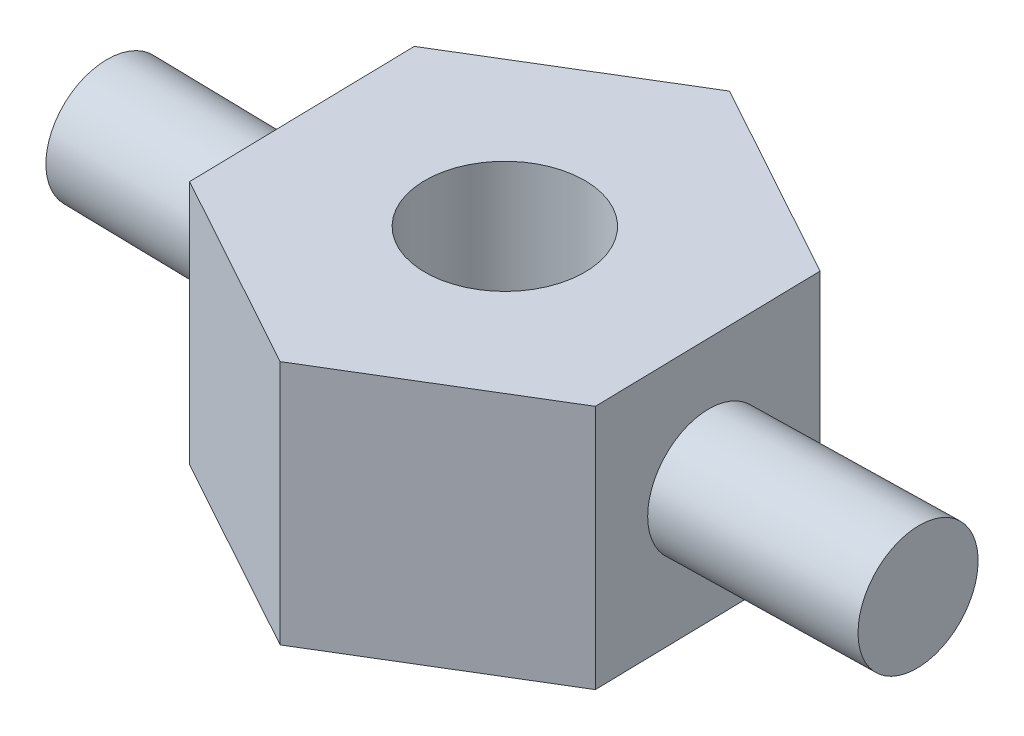
ISO-10303-21;
HEADER;
FILE_DESCRIPTION(('STEP AP214'),'2;1');
FILE_NAME('part.step','',(''),(''),'','','');
FILE_SCHEMA(('AUTOMOTIVE_DESIGN { 1 0 10303 214 1 1 1 1 }'));
ENDSEC;
DATA;
#1=APPLICATION_CONTEXT('core data for automotive mechanical design processes');
#2=APPLICATION_PROTOCOL_DEFINITION('international standard','automotive_design',2000,#1);
#3=PRODUCT_CONTEXT('',#1,'mechanical');
#4=PRODUCT('Part','Part','',(#3));
#5=PRODUCT_RELATED_PRODUCT_CATEGORY('part','',(#4));
#6=PRODUCT_DEFINITION_FORMATION('','',#4);
#7=PRODUCT_DEFINITION_CONTEXT('part definition',#1,'design');
#8=PRODUCT_DEFINITION('design','',#6,#7);
#9=PRODUCT_DEFINITION_SHAPE('','',#8);
#10=(LENGTH_UNIT() NAMED_UNIT(*) SI_UNIT(.MILLI.,.METRE.));
#11=(NAMED_UNIT(*) PLANE_ANGLE_UNIT() SI_UNIT($,.RADIAN.));
#12=(NAMED_UNIT(*) SI_UNIT($,.STERADIAN.) SOLID_ANGLE_UNIT());
#13=UNCERTAINTY_MEASURE_WITH_UNIT(LENGTH_MEASURE(1.E-05),#10,'distance_accuracy_value','');
#14=(GEOMETRIC_REPRESENTATION_CONTEXT(3) GLOBAL_UNCERTAINTY_ASSIGNED_CONTEXT((#13)) GLOBAL_UNIT_ASSIGNED_CONTEXT((#10,
#11,#12)) REPRESENTATION_CONTEXT('',''));
#15=CARTESIAN_POINT('',(0.,0.,0.));
#16=DIRECTION('',(0.,0.,1.));
#17=DIRECTION('',(1.,0.,0.));
#18=AXIS2_PLACEMENT_3D('',#15,#16,#17);
#19=CARTESIAN_POINT('',(-81.9743648724854,100.,-45.0777223401047));
#20=DIRECTION('',(0.999783018308974,0.,-0.0208306577187702));
#21=DIRECTION('',(-0.0208306577187702,0.,-0.999783018308973));
#22=AXIS2_PLACEMENT_3D('',#19,#20,#21);
#23=PLANE('',#22);
#24=DIRECTION('',(0.,1.,0.));
#25=VECTOR('',#24,1.);
#26=CARTESIAN_POINT('',(-81.0351624779531,100.,6.24500451351651E-13));
#27=LINE('',#26,#25);
#28=CARTESIAN_POINT('',(-81.0351624779531,25.0570530432761,6.38378239159465E-13));
#29=VERTEX_POINT('',#28);
#30=CARTESIAN_POINT('',(-81.0351624779531,74.9429469567239,6.38378239159465E-13));
#31=VERTEX_POINT('',#30);
#32=EDGE_CURVE('E51',#29,#31,#27,.T.);
#33=ORIENTED_EDGE('',*,*,#32,.F.);
#34=CARTESIAN_POINT('',(-81.070355497556,50.,-1.68911533361008));
#35=DIRECTION('',(0.999783018308974,0.,-0.0208306577187702));
#36=DIRECTION('',(0.0208306577187702,0.,0.999783018308973));
#37=AXIS2_PLACEMENT_3D('',#34,#35,#36);
#38=ELLIPSE('',#37,25.0217146597395,25.);
#39=EDGE_CURVE('E11',#29,#31,#38,.T.);
#40=ORIENTED_EDGE('',*,*,#39,.T.);
#41=EDGE_LOOP('',(#33,#40));
#42=FACE_BOUND('',#41,.T.);
#43=DIRECTION('',(0.0208306577187702,0.,0.999783018308973));
#44=VECTOR('',#43,1.);
#45=CARTESIAN_POINT('',(-81.9743648724854,0.,-45.0777223401047));
#46=LINE('',#45,#44);
#47=CARTESIAN_POINT('',(-81.9743648724854,0.,-45.0777223401047));
#48=VERTEX_POINT('',#47);
#49=CARTESIAN_POINT('',(-80.0256351275146,0.,48.4530212686147));
#50=VERTEX_POINT('',#49);
#51=EDGE_CURVE('E141',#48,#50,#46,.T.);
#52=ORIENTED_EDGE('',*,*,#51,.T.);
#53=DIRECTION('',(0.,-1.,0.));
#54=VECTOR('',#53,1.);
#55=CARTESIAN_POINT('',(-80.0256351275146,100.,48.4530212686147));
#56=LINE('',#55,#54);
#57=CARTESIAN_POINT('',(-80.0256351275146,100.,48.4530212686147));
#58=VERTEX_POINT('',#57);
#59=EDGE_CURVE('E170',#58,#50,#56,.T.);
#60=ORIENTED_EDGE('',*,*,#59,.F.);
#61=DIRECTION('',(0.0208306577187702,0.,0.999783018308973));
#62=VECTOR('',#61,1.);
#63=CARTESIAN_POINT('',(-81.9743648724854,100.,-45.0777223401047));
#64=LINE('',#63,#62);
#65=CARTESIAN_POINT('',(-81.9743648724854,100.,-45.0777223401047));
#66=VERTEX_POINT('',#65);
#67=EDGE_CURVE('E159',#66,#58,#64,.T.);
#68=ORIENTED_EDGE('',*,*,#67,.F.);
#69=DIRECTION('',(0.,-1.,0.));
#70=VECTOR('',#69,1.);
#71=CARTESIAN_POINT('',(-81.9743648724854,100.,-45.0777223401047));
#72=LINE('',#71,#70);
#73=EDGE_CURVE('E137',#66,#48,#72,.T.);
#74=ORIENTED_EDGE('',*,*,#73,.T.);
#75=EDGE_LOOP('',(#52,#60,#68,#74));
#76=FACE_BOUND('',#75,.T.);
#77=ADVANCED_FACE('F43',(#42,#76),#23,.F.);
#78=CARTESIAN_POINT('',(-80.0256351275146,100.,48.4530212686147));
#79=DIRECTION('',(0.481851630392494,0.,-0.876252820987238));
#80=DIRECTION('',(-0.876252820987239,0.,-0.481851630392493));
#81=AXIS2_PLACEMENT_3D('',#78,#79,#80);
#82=PLANE('',#81);
#83=DIRECTION('',(0.876252820987239,0.,0.481851630392493));
#84=VECTOR('',#83,1.);
#85=CARTESIAN_POINT('',(-80.0256351275146,0.,48.4530212686147));
#86=LINE('',#85,#84);
#87=CARTESIAN_POINT('',(1.94872974497068,0.,93.5307436087193));
#88=VERTEX_POINT('',#87);
#89=EDGE_CURVE('E145',#50,#88,#86,.T.);
#90=ORIENTED_EDGE('',*,*,#89,.T.);
#91=DIRECTION('',(0.,-1.,0.));
#92=VECTOR('',#91,1.);
#93=CARTESIAN_POINT('',(1.94872974497046,100.,93.5307436087193));
#94=LINE('',#93,#92);
#95=CARTESIAN_POINT('',(1.94872974497046,100.,93.5307436087193));
#96=VERTEX_POINT('',#95);
#97=EDGE_CURVE('E166',#96,#88,#94,.T.);
#98=ORIENTED_EDGE('',*,*,#97,.F.);
#99=DIRECTION('',(0.876252820987239,0.,0.481851630392493));
#100=VECTOR('',#99,1.);
#101=CARTESIAN_POINT('',(-80.0256351275146,100.,48.4530212686147));
#102=LINE('',#101,#100);
#103=EDGE_CURVE('E100',#58,#96,#102,.T.);
#104=ORIENTED_EDGE('',*,*,#103,.F.);
#105=ORIENTED_EDGE('',*,*,#59,.T.);
#106=EDGE_LOOP('',(#90,#98,#104,#105));
#107=FACE_BOUND('',#106,.T.);
#108=ADVANCED_FACE('F227',(#107),#82,.F.);
#109=CARTESIAN_POINT('',(1.94872974497046,100.,93.5307436087193));
#110=DIRECTION('',(-0.51793138791648,0.,-0.855422163268468));
#111=DIRECTION('',(-0.855422163268469,0.,0.51793138791648));
#112=AXIS2_PLACEMENT_3D('',#109,#110,#111);
#113=PLANE('',#112);
#114=DIRECTION('',(0.855422163268469,0.,-0.51793138791648));
#115=VECTOR('',#114,1.);
#116=CARTESIAN_POINT('',(1.94872974497068,0.,93.5307436087193));
#117=LINE('',#116,#115);
#118=CARTESIAN_POINT('',(81.9743648724854,0.,45.0777223401046));
#119=VERTEX_POINT('',#118);
#120=EDGE_CURVE('E149',#88,#119,#117,.T.);
#121=ORIENTED_EDGE('',*,*,#120,.T.);
#122=DIRECTION('',(0.,-1.,0.));
#123=VECTOR('',#122,1.);
#124=CARTESIAN_POINT('',(81.9743648724853,100.,45.0777223401046));
#125=LINE('',#124,#123);
#126=CARTESIAN_POINT('',(81.9743648724853,100.,45.0777223401046));
#127=VERTEX_POINT('',#126);
#128=EDGE_CURVE('E129',#127,#119,#125,.T.);
#129=ORIENTED_EDGE('',*,*,#128,.F.);
#130=DIRECTION('',(0.855422163268469,0.,-0.51793138791648));
#131=VECTOR('',#130,1.);
#132=CARTESIAN_POINT('',(1.94872974497046,100.,93.5307436087193));
#133=LINE('',#132,#131);
#134=EDGE_CURVE('E115',#96,#127,#133,.T.);
#135=ORIENTED_EDGE('',*,*,#134,.F.);
#136=ORIENTED_EDGE('',*,*,#97,.T.);
#137=EDGE_LOOP('',(#121,#129,#135,#136));
#138=FACE_BOUND('',#137,.T.);
#139=ADVANCED_FACE('F235',(#138),#113,.F.);
#140=CARTESIAN_POINT('',(81.9743648724853,100.,45.0777223401046));
#141=DIRECTION('',(-0.999783018308974,0.,0.0208306577187704));
#142=DIRECTION('',(0.0208306577187704,0.,0.999783018308973));
#143=AXIS2_PLACEMENT_3D('',#140,#141,#142);
#144=PLANE('',#143);
#145=CARTESIAN_POINT('',(80.9999999999997,50.,-1.68764946425502));
#146=DIRECTION('',(0.999783018308974,0.,-0.0208306577187704));
#147=DIRECTION('',(-0.0208306577187704,0.,-0.999783018308973));
#148=AXIS2_PLACEMENT_3D('',#145,#146,#147);
#149=CIRCLE('',#148,25.);
#150=CARTESIAN_POINT('',(81.5207664429689,50.0000000000001,23.3069259934693));
#151=VERTEX_POINT('',#150);
#152=EDGE_CURVE('E172',#151,#151,#149,.T.);
#153=ORIENTED_EDGE('',*,*,#152,.F.);
#154=EDGE_LOOP('',(#153));
#155=FACE_BOUND('',#154,.T.);
#156=DIRECTION('',(-0.0208306577187704,0.,-0.999783018308973));
#157=VECTOR('',#156,1.);
#158=CARTESIAN_POINT('',(81.9743648724854,0.,45.0777223401046));
#159=LINE('',#158,#157);
#160=CARTESIAN_POINT('',(80.0256351275146,0.,-48.4530212686147));
#161=VERTEX_POINT('',#160);
#162=EDGE_CURVE('E125',#119,#161,#159,.T.);
#163=ORIENTED_EDGE('',*,*,#162,.T.);
#164=DIRECTION('',(0.,-1.,0.));
#165=VECTOR('',#164,1.);
#166=CARTESIAN_POINT('',(80.0256351275146,100.,-48.4530212686148));
#167=LINE('',#166,#165);
#168=CARTESIAN_POINT('',(80.0256351275146,100.,-48.4530212686148));
#169=VERTEX_POINT('',#168);
#170=EDGE_CURVE('E122',#169,#161,#167,.T.);
#171=ORIENTED_EDGE('',*,*,#170,.F.);
#172=DIRECTION('',(-0.0208306577187704,0.,-0.999783018308973));
#173=VECTOR('',#172,1.);
#174=CARTESIAN_POINT('',(81.9743648724853,100.,45.0777223401046));
#175=LINE('',#174,#173);
#176=EDGE_CURVE('E108',#127,#169,#175,.T.);
#177=ORIENTED_EDGE('',*,*,#176,.F.);
#178=ORIENTED_EDGE('',*,*,#128,.T.);
#179=EDGE_LOOP('',(#163,#171,#177,#178));
#180=FACE_BOUND('',#179,.T.);
#181=ADVANCED_FACE('F123',(#155,#180),#144,.F.);
#182=CARTESIAN_POINT('',(80.0256351275146,100.,-48.4530212686148));
#183=DIRECTION('',(-0.481851630392494,0.,0.876252820987238));
#184=DIRECTION('',(0.876252820987239,0.,0.481851630392493));
#185=AXIS2_PLACEMENT_3D('',#182,#183,#184);
#186=PLANE('',#185);
#187=DIRECTION('',(-0.876252820987239,0.,-0.481851630392493));
#188=VECTOR('',#187,1.);
#189=CARTESIAN_POINT('',(80.0256351275146,0.,-48.4530212686147));
#190=LINE('',#189,#188);
#191=CARTESIAN_POINT('',(-1.94872974497073,1.11022302462516E-13,-93.5307436087193));
#192=VERTEX_POINT('',#191);
#193=EDGE_CURVE('E154',#161,#192,#190,.T.);
#194=ORIENTED_EDGE('',*,*,#193,.T.);
#195=DIRECTION('',(0.,-1.,0.));
#196=VECTOR('',#195,1.);
#197=CARTESIAN_POINT('',(-1.94872974497101,100.,-93.5307436087193));
#198=LINE('',#197,#196);
#199=CARTESIAN_POINT('',(-1.94872974497101,100.,-93.5307436087193));
#200=VERTEX_POINT('',#199);
#201=EDGE_CURVE('E130',#200,#192,#198,.T.);
#202=ORIENTED_EDGE('',*,*,#201,.F.);
#203=DIRECTION('',(-0.876252820987239,0.,-0.481851630392493));
#204=VECTOR('',#203,1.);
#205=CARTESIAN_POINT('',(80.0256351275146,100.,-48.4530212686148));
#206=LINE('',#205,#204);
#207=EDGE_CURVE('E112',#169,#200,#206,.T.);
#208=ORIENTED_EDGE('',*,*,#207,.F.);
#209=ORIENTED_EDGE('',*,*,#170,.T.);
#210=EDGE_LOOP('',(#194,#202,#208,#209));
#211=FACE_BOUND('',#210,.T.);
#212=ADVANCED_FACE('F132',(#211),#186,.F.);
#213=CARTESIAN_POINT('',(-1.94872974497101,100.,-93.5307436087193));
#214=DIRECTION('',(0.51793138791648,0.,0.855422163268468));
#215=DIRECTION('',(0.855422163268469,0.,-0.51793138791648));
#216=AXIS2_PLACEMENT_3D('',#213,#214,#215);
#217=PLANE('',#216);
#218=DIRECTION('',(-0.855422163268469,0.,0.51793138791648));
#219=VECTOR('',#218,1.);
#220=CARTESIAN_POINT('',(-1.94872974497073,1.11022302462516E-13,-93.5307436087193));
#221=LINE('',#220,#219);
#222=EDGE_CURVE('E91',#192,#48,#221,.T.);
#223=ORIENTED_EDGE('',*,*,#222,.T.);
#224=ORIENTED_EDGE('',*,*,#73,.F.);
#225=DIRECTION('',(-0.855422163268469,0.,0.51793138791648));
#226=VECTOR('',#225,1.);
#227=CARTESIAN_POINT('',(-1.94872974497101,100.,-93.5307436087193));
#228=LINE('',#227,#226);
#229=EDGE_CURVE('E64',#200,#66,#228,.T.);
#230=ORIENTED_EDGE('',*,*,#229,.F.);
#231=ORIENTED_EDGE('',*,*,#201,.T.);
#232=EDGE_LOOP('',(#223,#224,#230,#231));
#233=FACE_BOUND('',#232,.T.);
#234=ADVANCED_FACE('F247',(#233),#217,.F.);
#235=CARTESIAN_POINT('',(-2.77555756156289E-13,100.,0.));
#236=DIRECTION('',(0.,1.,0.));
#237=DIRECTION('',(0.,0.,0.999999999999998));
#238=AXIS2_PLACEMENT_3D('',#235,#236,#237);
#239=PLANE('',#238);
#240=CARTESIAN_POINT('',(-2.77555756156289E-13,100.,0.));
#241=DIRECTION('',(0.,-1.,0.));
#242=DIRECTION('',(0.,0.,-0.999999999999998));
#243=AXIS2_PLACEMENT_3D('',#240,#241,#242);
#244=CIRCLE('',#243,32.5);
#245=CARTESIAN_POINT('',(-2.76428185896904E-13,100.,-32.4999999999999));
#246=VERTEX_POINT('',#245);
#247=EDGE_CURVE('E146',#246,#246,#244,.T.);
#248=ORIENTED_EDGE('',*,*,#247,.T.);
#249=EDGE_LOOP('',(#248));
#250=FACE_BOUND('',#249,.T.);
#251=ORIENTED_EDGE('',*,*,#67,.T.);
#252=ORIENTED_EDGE('',*,*,#103,.T.);
#253=ORIENTED_EDGE('',*,*,#134,.T.);
#254=ORIENTED_EDGE('',*,*,#176,.T.);
#255=ORIENTED_EDGE('',*,*,#207,.T.);
#256=ORIENTED_EDGE('',*,*,#229,.T.);
#257=EDGE_LOOP('',(#251,#252,#253,#254,#255,#256));
#258=FACE_BOUND('',#257,.T.);
#259=ADVANCED_FACE('F110',(#250,#258),#239,.T.);
#260=CARTESIAN_POINT('',(0.,0.,0.));
#261=DIRECTION('',(0.,1.,0.));
#262=DIRECTION('',(0.,0.,0.999999999999998));
#263=AXIS2_PLACEMENT_3D('',#260,#261,#262);
#264=PLANE('',#263);
#265=CARTESIAN_POINT('',(0.,0.,0.));
#266=DIRECTION('',(0.,-1.,0.));
#267=DIRECTION('',(0.,0.,-0.999999999999998));
#268=AXIS2_PLACEMENT_3D('',#265,#266,#267);
#269=CIRCLE('',#268,32.5);
#270=CARTESIAN_POINT('',(0.,0.,-32.5));
#271=VERTEX_POINT('',#270);
#272=EDGE_CURVE('E191',#271,#271,#269,.T.);
#273=ORIENTED_EDGE('',*,*,#272,.F.);
#274=EDGE_LOOP('',(#273));
#275=FACE_BOUND('',#274,.T.);
#276=ORIENTED_EDGE('',*,*,#51,.F.);
#277=ORIENTED_EDGE('',*,*,#222,.F.);
#278=ORIENTED_EDGE('',*,*,#193,.F.);
#279=ORIENTED_EDGE('',*,*,#162,.F.);
#280=ORIENTED_EDGE('',*,*,#120,.F.);
#281=ORIENTED_EDGE('',*,*,#89,.F.);
#282=EDGE_LOOP('',(#276,#277,#278,#279,#280,#281));
#283=FACE_BOUND('',#282,.T.);
#284=ADVANCED_FACE('F232',(#275,#283),#264,.F.);
#285=CARTESIAN_POINT('',(-2.77555756156289E-13,100.,0.));
#286=DIRECTION('',(0.,-1.,0.));
#287=DIRECTION('',(0.,0.,-0.999999999999998));
#288=AXIS2_PLACEMENT_3D('',#285,#286,#287);
#289=CYLINDRICAL_SURFACE('',#288,32.5);
#290=ORIENTED_EDGE('',*,*,#247,.F.);
#291=EDGE_LOOP('',(#290));
#292=FACE_BOUND('',#291,.T.);
#293=ORIENTED_EDGE('',*,*,#272,.T.);
#294=EDGE_LOOP('',(#293));
#295=FACE_BOUND('',#294,.T.);
#296=ADVANCED_FACE('F252',(#292,#295),#289,.F.);
#297=CARTESIAN_POINT('',(164.981773537954,50.0000000000001,-3.43742471263175));
#298=DIRECTION('',(-0.999783018308974,0.,0.0208306577187704));
#299=DIRECTION('',(0.0208306577187704,0.,0.999783018308973));
#300=AXIS2_PLACEMENT_3D('',#297,#298,#299);
#301=CYLINDRICAL_SURFACE('',#300,25.);
#302=CARTESIAN_POINT('',(164.981773537954,50.0000000000001,-3.43742471263175));
#303=DIRECTION('',(0.999783018308974,0.,-0.0208306577187704));
#304=DIRECTION('',(-0.0208306577187704,0.,-0.999783018308973));
#305=AXIS2_PLACEMENT_3D('',#302,#303,#304);
#306=CIRCLE('',#305,25.);
#307=CARTESIAN_POINT('',(165.502539980923,50.0000000000001,21.5571507450926));
#308=VERTEX_POINT('',#307);
#309=EDGE_CURVE('E186',#308,#308,#306,.T.);
#310=CARTESIAN_POINT('',(165.502539980923,50.0000000000001,21.5571507450926));
#311=CARTESIAN_POINT('',(164.627729839902,50.0000000000001,21.5753775705965));
#312=CARTESIAN_POINT('',(163.752919698882,50.0000000000001,21.5936043961004));
#313=CARTESIAN_POINT('',(162.003299416841,50.0000000000001,21.6300580471083));
#314=CARTESIAN_POINT('',(161.128489275821,50.0000000000001,21.6482848726122));
#315=CARTESIAN_POINT('',(159.37886899378,50.0000000000001,21.6847385236201));
#316=CARTESIAN_POINT('',(158.50405885276,50.0000000000001,21.702965349124));
#317=CARTESIAN_POINT('',(156.754438570719,50.0000000000001,21.7394190001318));
#318=CARTESIAN_POINT('',(155.879628429699,50.0000000000001,21.7576458256357));
#319=CARTESIAN_POINT('',(154.130008147658,50.0000000000001,21.7940994766436));
#320=CARTESIAN_POINT('',(153.255198006638,50.0000000000001,21.8123263021475));
#321=CARTESIAN_POINT('',(151.505577724597,50.0000000000001,21.8487799531554));
#322=CARTESIAN_POINT('',(150.630767583577,50.0000000000001,21.8670067786593));
#323=CARTESIAN_POINT('',(148.881147301536,50.0000000000001,21.9034604296671));
#324=CARTESIAN_POINT('',(148.006337160516,50.0000000000001,21.9216872551711));
#325=CARTESIAN_POINT('',(146.256716878475,50.0000000000001,21.9581409061789));
#326=CARTESIAN_POINT('',(145.381906737455,50.0000000000001,21.9763677316828));
#327=CARTESIAN_POINT('',(143.632286455414,50.0000000000001,22.0128213826907));
#328=CARTESIAN_POINT('',(142.757476314394,50.0000000000001,22.0310482081946));
#329=CARTESIAN_POINT('',(141.007856032353,50.0000000000001,22.0675018592025));
#330=CARTESIAN_POINT('',(140.133045891333,50.0000000000001,22.0857286847064));
#331=CARTESIAN_POINT('',(138.383425609292,50.0000000000001,22.1221823357142));
#332=CARTESIAN_POINT('',(137.508615468272,50.0000000000001,22.1404091612182));
#333=CARTESIAN_POINT('',(135.758995186231,50.0000000000001,22.176862812226));
#334=CARTESIAN_POINT('',(134.88418504521,50.0000000000001,22.1950896377299));
#335=CARTESIAN_POINT('',(133.13456476317,50.0000000000001,22.2315432887378));
#336=CARTESIAN_POINT('',(132.259754622149,50.0000000000001,22.2497701142417));
#337=CARTESIAN_POINT('',(130.510134340109,50.0000000000001,22.2862237652495));
#338=CARTESIAN_POINT('',(129.635324199088,50.0000000000001,22.3044505907535));
#339=CARTESIAN_POINT('',(127.885703917048,50.0000000000001,22.3409042417613));
#340=CARTESIAN_POINT('',(127.010893776027,50.0000000000001,22.3591310672652));
#341=CARTESIAN_POINT('',(125.261273493987,50.0000000000001,22.3955847182731));
#342=CARTESIAN_POINT('',(124.386463352966,50.0000000000001,22.413811543777));
#343=CARTESIAN_POINT('',(122.636843070926,50.0000000000001,22.4502651947849));
#344=CARTESIAN_POINT('',(121.762032929905,50.0000000000001,22.4684920202888));
#345=CARTESIAN_POINT('',(120.012412647864,50.0000000000001,22.5049456712966));
#346=CARTESIAN_POINT('',(119.137602506844,50.0000000000001,22.5231724968006));
#347=CARTESIAN_POINT('',(117.387982224803,50.0000000000001,22.5596261478084));
#348=CARTESIAN_POINT('',(116.513172083783,50.0000000000001,22.5778529733123));
#349=CARTESIAN_POINT('',(114.763551801742,50.0000000000001,22.6143066243202));
#350=CARTESIAN_POINT('',(113.888741660722,50.0000000000001,22.6325334498241));
#351=CARTESIAN_POINT('',(112.139121378681,50.0000000000001,22.668987100832));
#352=CARTESIAN_POINT('',(111.264311237661,50.0000000000001,22.6872139263359));
#353=CARTESIAN_POINT('',(109.51469095562,50.0000000000001,22.7236675773437));
#354=CARTESIAN_POINT('',(108.6398808146,50.0000000000001,22.7418944028476));
#355=CARTESIAN_POINT('',(106.890260532559,50.0000000000001,22.7783480538555));
#356=CARTESIAN_POINT('',(106.015450391539,50.0000000000001,22.7965748793594));
#357=CARTESIAN_POINT('',(104.265830109498,50.0000000000001,22.8330285303673));
#358=CARTESIAN_POINT('',(103.391019968478,50.0000000000001,22.8512553558712));
#359=CARTESIAN_POINT('',(101.641399686437,50.0000000000001,22.887709006879));
#360=CARTESIAN_POINT('',(100.766589545417,50.0000000000001,22.905935832383));
#361=CARTESIAN_POINT('',(99.016969263376,50.0000000000001,22.9423894833908));
#362=CARTESIAN_POINT('',(98.1421591223556,50.0000000000001,22.9606163088947));
#363=CARTESIAN_POINT('',(96.3925388403149,50.0000000000001,22.9970699599026));
#364=CARTESIAN_POINT('',(95.5177286992946,50.0000000000001,23.0152967854065));
#365=CARTESIAN_POINT('',(93.7681084172539,50.0000000000001,23.0517504364144));
#366=CARTESIAN_POINT('',(92.8932982762335,50.0000000000001,23.0699772619183));
#367=CARTESIAN_POINT('',(91.1436779941928,50.0000000000001,23.1064309129261));
#368=CARTESIAN_POINT('',(90.2688678531725,50.0000000000001,23.1246577384301));
#369=CARTESIAN_POINT('',(88.5192475711318,50.0000000000001,23.1611113894379));
#370=CARTESIAN_POINT('',(87.6444374301114,50.0000000000001,23.1793382149418));
#371=CARTESIAN_POINT('',(85.8948171480707,50.0000000000001,23.2157918659497));
#372=CARTESIAN_POINT('',(85.0200070070503,50.0000000000001,23.2340186914536));
#373=CARTESIAN_POINT('',(83.2703867250096,50.0000000000001,23.2704723424614));
#374=CARTESIAN_POINT('',(82.3955765839893,50.0000000000001,23.2886991679654));
#375=CARTESIAN_POINT('',(81.5207664429689,50.0000000000001,23.3069259934693));
#376=B_SPLINE_CURVE_WITH_KNOTS('',3,(#310,#311,#312,#313,#314,#315,#316,#317,#318,#319,#320,
#321,#322,#323,#324,#325,#326,#327,#328,#329,#330,#331,#332,#333,#334,#335,#336,#337,#338,#339,
#340,#341,#342,#343,#344,#345,#346,#347,#348,#349,#350,#351,#352,#353,#354,#355,#356,#357,#358,
#359,#360,#361,#362,#363,#364,#365,#366,#367,#368,#369,#370,#371,#372,#373,#374,#375),
.UNSPECIFIED.,.F.,.F.,(4,2,2,2,2,2,2,2,2,2,2,2,2,2,2,2,2,2,2,2,2,2,2,2,2,2,2,2,2,2,2,2,4),(0.,
2.62499999999998,5.24999999999999,7.87499999999998,10.5,13.125,15.75,18.375,21.,23.625,26.25,
28.875,31.5,34.125,36.75,39.375,42.,44.625,47.25,49.875,52.5,55.125,57.75,60.375,63.,65.625,
68.25,70.875,73.5,76.125,78.75,81.375,84.),.UNSPECIFIED.);
#377=EDGE_CURVE('BSEAM259',#308,#151,#376,.T.);
#378=ORIENTED_EDGE('',*,*,#309,.F.);
#379=ORIENTED_EDGE('',*,*,#152,.T.);
#380=ORIENTED_EDGE('',*,*,#377,.T.);
#381=ORIENTED_EDGE('',*,*,#377,.F.);
#382=EDGE_LOOP('',(#378,#380,#379,#381));
#383=FACE_BOUND('',#382,.T.);
#384=ADVANCED_FACE('F259',(#383),#301,.T.);
#385=CARTESIAN_POINT('',(164.981773537954,50.0000000000001,-3.43742471263175));
#386=DIRECTION('',(0.999783018308974,0.,-0.0208306577187704));
#387=DIRECTION('',(-0.0208306577187704,0.,-0.999783018308973));
#388=AXIS2_PLACEMENT_3D('',#385,#386,#387);
#389=PLANE('',#388);
#390=ORIENTED_EDGE('',*,*,#309,.T.);
#391=EDGE_LOOP('',(#390));
#392=FACE_BOUND('',#391,.T.);
#393=ADVANCED_FACE('F263',(#392),#389,.T.);
#394=CARTESIAN_POINT('',(-164.981773537954,50.,-3.43742471263171));
#395=DIRECTION('',(0.999783018308974,0.,0.0208306577187703));
#396=DIRECTION('',(0.0208306577187704,0.,-0.999783018308973));
#397=AXIS2_PLACEMENT_3D('',#394,#395,#396);
#398=CYLINDRICAL_SURFACE('',#397,25.);
#399=CARTESIAN_POINT('',(-164.981773537954,50.,-3.43742471263171));
#400=DIRECTION('',(0.999783018308974,0.,0.0208306577187703));
#401=DIRECTION('',(0.0208306577187704,0.,-0.999783018308973));
#402=AXIS2_PLACEMENT_3D('',#399,#400,#401);
#403=CIRCLE('',#402,25.);
#404=CARTESIAN_POINT('',(-164.461007094985,50.,-28.432000170356));
#405=VERTEX_POINT('',#404);
#406=EDGE_CURVE('E215',#405,#405,#403,.T.);
#407=ORIENTED_EDGE('',*,*,#406,.T.);
#408=EDGE_LOOP('',(#407));
#409=FACE_BOUND('',#408,.T.);
#410=ORIENTED_EDGE('',*,*,#39,.F.);
#411=CARTESIAN_POINT('',(-81.,50.,-1.68764946425509));
#412=DIRECTION('',(0.999783018308974,0.,0.0208306577187703));
#413=DIRECTION('',(0.0208306577187704,0.,-0.999783018308973));
#414=AXIS2_PLACEMENT_3D('',#411,#412,#413);
#415=CIRCLE('',#414,25.);
#416=EDGE_CURVE('E219',#31,#29,#415,.T.);
#417=ORIENTED_EDGE('',*,*,#416,.F.);
#418=EDGE_LOOP('',(#410,#417));
#419=FACE_BOUND('',#418,.T.);
#420=ADVANCED_FACE('F224',(#409,#419),#398,.T.);
#421=CARTESIAN_POINT('',(-81.,50.,-1.68764946425509));
#422=DIRECTION('',(-0.999783018308974,0.,-0.0208306577187703));
#423=DIRECTION('',(0.0208306577187704,0.,-0.999783018308973));
#424=AXIS2_PLACEMENT_3D('',#421,#422,#423);
#425=PLANE('',#424);
#426=ORIENTED_EDGE('',*,*,#416,.T.);
#427=ORIENTED_EDGE('',*,*,#32,.T.);
#428=EDGE_LOOP('',(#426,#427));
#429=FACE_BOUND('',#428,.T.);
#430=ADVANCED_FACE('F222',(#429),#425,.F.);
#431=CARTESIAN_POINT('',(-164.981773537954,50.,-3.43742471263171));
#432=DIRECTION('',(-0.999783018308974,0.,-0.0208306577187703));
#433=DIRECTION('',(0.0208306577187704,0.,-0.999783018308973));
#434=AXIS2_PLACEMENT_3D('',#431,#432,#433);
#435=PLANE('',#434);
#436=ORIENTED_EDGE('',*,*,#406,.F.);
#437=EDGE_LOOP('',(#436));
#438=FACE_BOUND('',#437,.T.);
#439=ADVANCED_FACE('F273',(#438),#435,.T.);
#440=CLOSED_SHELL('',(#77,#108,#139,#181,#212,#234,#259,#284,#296,#384,#393,#420,#430,#439));
#441=MANIFOLD_SOLID_BREP('B2',#440);
#442=ADVANCED_BREP_SHAPE_REPRESENTATION('',(#18,#441),#14);
#443=SHAPE_DEFINITION_REPRESENTATION(#9,#442);
ENDSEC;
END-ISO-10303-21;
